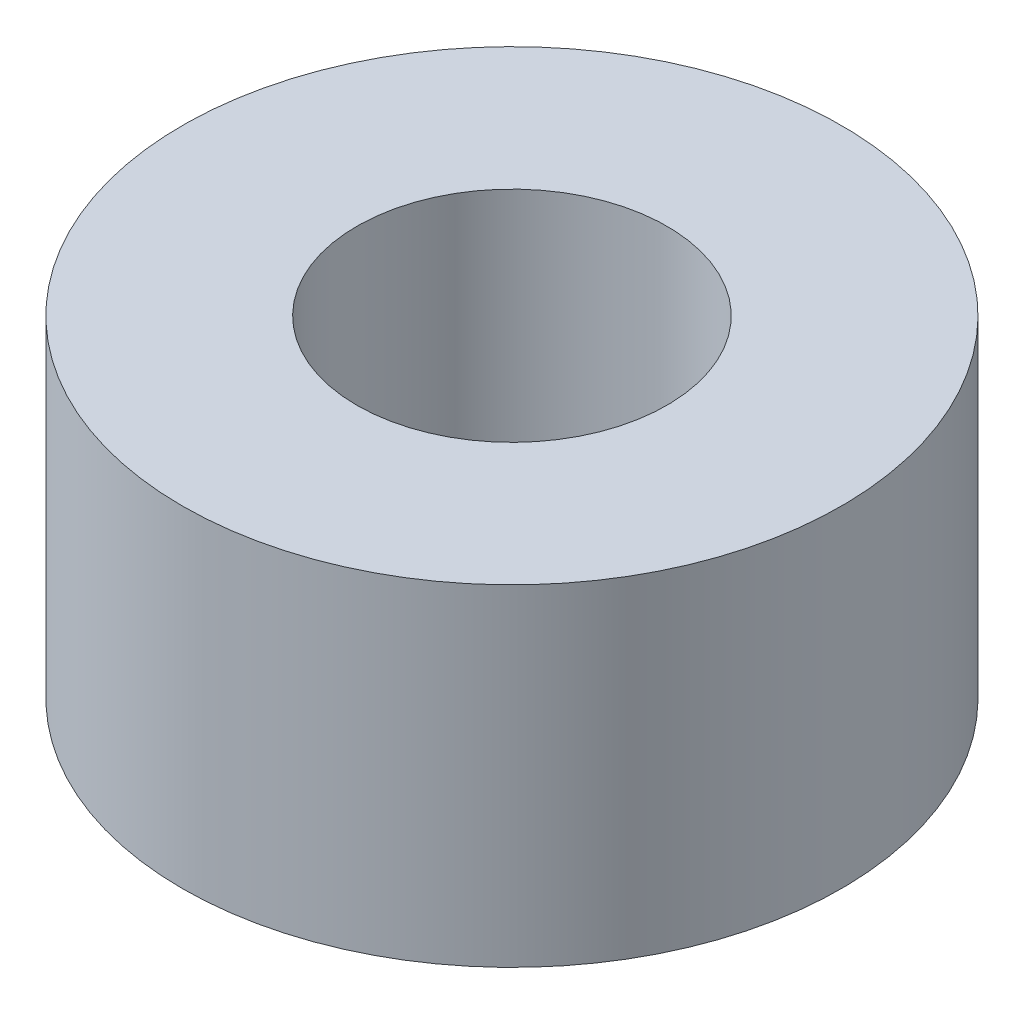
ISO-10303-21;
HEADER;
FILE_DESCRIPTION(('STEP AP214'),'2;1');
FILE_NAME('part.step','',(''),(''),'','','');
FILE_SCHEMA(('AUTOMOTIVE_DESIGN { 1 0 10303 214 1 1 1 1 }'));
ENDSEC;
DATA;
#1=APPLICATION_CONTEXT('core data for automotive mechanical design processes');
#2=APPLICATION_PROTOCOL_DEFINITION('international standard','automotive_design',2000,#1);
#3=PRODUCT_CONTEXT('',#1,'mechanical');
#4=PRODUCT('Part','Part','',(#3));
#5=PRODUCT_RELATED_PRODUCT_CATEGORY('part','',(#4));
#6=PRODUCT_DEFINITION_FORMATION('','',#4);
#7=PRODUCT_DEFINITION_CONTEXT('part definition',#1,'design');
#8=PRODUCT_DEFINITION('design','',#6,#7);
#9=PRODUCT_DEFINITION_SHAPE('','',#8);
#10=(LENGTH_UNIT() NAMED_UNIT(*) SI_UNIT(.MILLI.,.METRE.));
#11=(NAMED_UNIT(*) PLANE_ANGLE_UNIT() SI_UNIT($,.RADIAN.));
#12=(NAMED_UNIT(*) SI_UNIT($,.STERADIAN.) SOLID_ANGLE_UNIT());
#13=UNCERTAINTY_MEASURE_WITH_UNIT(LENGTH_MEASURE(1.E-05),#10,'distance_accuracy_value','');
#14=(GEOMETRIC_REPRESENTATION_CONTEXT(3) GLOBAL_UNCERTAINTY_ASSIGNED_CONTEXT((#13)) GLOBAL_UNIT_ASSIGNED_CONTEXT((#10,
#11,#12)) REPRESENTATION_CONTEXT('',''));
#15=CARTESIAN_POINT('',(0.,0.,0.));
#16=DIRECTION('',(0.,0.,1.));
#17=DIRECTION('',(1.,0.,0.));
#18=AXIS2_PLACEMENT_3D('',#15,#16,#17);
#19=CARTESIAN_POINT('',(0.,4.7,0.));
#20=DIRECTION('',(0.,1.,0.));
#21=DIRECTION('',(0.,0.,1.));
#22=AXIS2_PLACEMENT_3D('',#19,#20,#21);
#23=PLANE('',#22);
#24=CARTESIAN_POINT('',(0.,4.7,0.));
#25=DIRECTION('',(0.,1.,0.));
#26=DIRECTION('',(0.,0.,1.));
#27=AXIS2_PLACEMENT_3D('',#24,#25,#26);
#28=CIRCLE('',#27,4.675);
#29=CARTESIAN_POINT('',(0.,4.7,4.675));
#30=VERTEX_POINT('',#29);
#31=EDGE_CURVE('E10',#30,#30,#28,.T.);
#32=ORIENTED_EDGE('',*,*,#31,.T.);
#33=EDGE_LOOP('',(#32));
#34=FACE_BOUND('',#33,.T.);
#35=CARTESIAN_POINT('',(0.,4.7,0.));
#36=DIRECTION('',(0.,1.,0.));
#37=DIRECTION('',(0.,0.,1.));
#38=AXIS2_PLACEMENT_3D('',#35,#36,#37);
#39=CIRCLE('',#38,2.2);
#40=CARTESIAN_POINT('',(0.,4.7,2.2));
#41=VERTEX_POINT('',#40);
#42=EDGE_CURVE('E42',#41,#41,#39,.T.);
#43=ORIENTED_EDGE('',*,*,#42,.F.);
#44=EDGE_LOOP('',(#43));
#45=FACE_BOUND('',#44,.T.);
#46=ADVANCED_FACE('F31',(#34,#45),#23,.T.);
#47=CARTESIAN_POINT('',(0.,0.,0.));
#48=DIRECTION('',(0.,1.,0.));
#49=DIRECTION('',(0.,0.,1.));
#50=AXIS2_PLACEMENT_3D('',#47,#48,#49);
#51=PLANE('',#50);
#52=CARTESIAN_POINT('',(0.,0.,0.));
#53=DIRECTION('',(0.,1.,0.));
#54=DIRECTION('',(0.,0.,1.));
#55=AXIS2_PLACEMENT_3D('',#52,#53,#54);
#56=CIRCLE('',#55,4.675);
#57=CARTESIAN_POINT('',(0.,0.,4.675));
#58=VERTEX_POINT('',#57);
#59=EDGE_CURVE('E35',#58,#58,#56,.T.);
#60=ORIENTED_EDGE('',*,*,#59,.F.);
#61=EDGE_LOOP('',(#60));
#62=FACE_BOUND('',#61,.T.);
#63=CARTESIAN_POINT('',(0.,0.,0.));
#64=DIRECTION('',(0.,1.,0.));
#65=DIRECTION('',(0.,0.,1.));
#66=AXIS2_PLACEMENT_3D('',#63,#64,#65);
#67=CIRCLE('',#66,2.2);
#68=CARTESIAN_POINT('',(0.,0.,2.2));
#69=VERTEX_POINT('',#68);
#70=EDGE_CURVE('E44',#69,#69,#67,.T.);
#71=ORIENTED_EDGE('',*,*,#70,.T.);
#72=EDGE_LOOP('',(#71));
#73=FACE_BOUND('',#72,.T.);
#74=ADVANCED_FACE('F54',(#62,#73),#51,.F.);
#75=CARTESIAN_POINT('',(0.,4.7,0.));
#76=DIRECTION('',(0.,-1.,0.));
#77=DIRECTION('',(0.,0.,-1.));
#78=AXIS2_PLACEMENT_3D('',#75,#76,#77);
#79=CYLINDRICAL_SURFACE('',#78,4.675);
#80=ORIENTED_EDGE('',*,*,#31,.F.);
#81=EDGE_LOOP('',(#80));
#82=FACE_BOUND('',#81,.T.);
#83=ORIENTED_EDGE('',*,*,#59,.T.);
#84=EDGE_LOOP('',(#83));
#85=FACE_BOUND('',#84,.T.);
#86=ADVANCED_FACE('F33',(#82,#85),#79,.T.);
#87=CARTESIAN_POINT('',(0.,4.7,0.));
#88=DIRECTION('',(0.,-1.,0.));
#89=DIRECTION('',(0.,0.,-1.));
#90=AXIS2_PLACEMENT_3D('',#87,#88,#89);
#91=CYLINDRICAL_SURFACE('',#90,2.2);
#92=ORIENTED_EDGE('',*,*,#42,.T.);
#93=EDGE_LOOP('',(#92));
#94=FACE_BOUND('',#93,.T.);
#95=ORIENTED_EDGE('',*,*,#70,.F.);
#96=EDGE_LOOP('',(#95));
#97=FACE_BOUND('',#96,.T.);
#98=ADVANCED_FACE('F50',(#94,#97),#91,.F.);
#99=CLOSED_SHELL('',(#46,#74,#86,#98));
#100=MANIFOLD_SOLID_BREP('B2',#99);
#101=ADVANCED_BREP_SHAPE_REPRESENTATION('',(#18,#100),#14);
#102=SHAPE_DEFINITION_REPRESENTATION(#9,#101);
ENDSEC;
END-ISO-10303-21;
